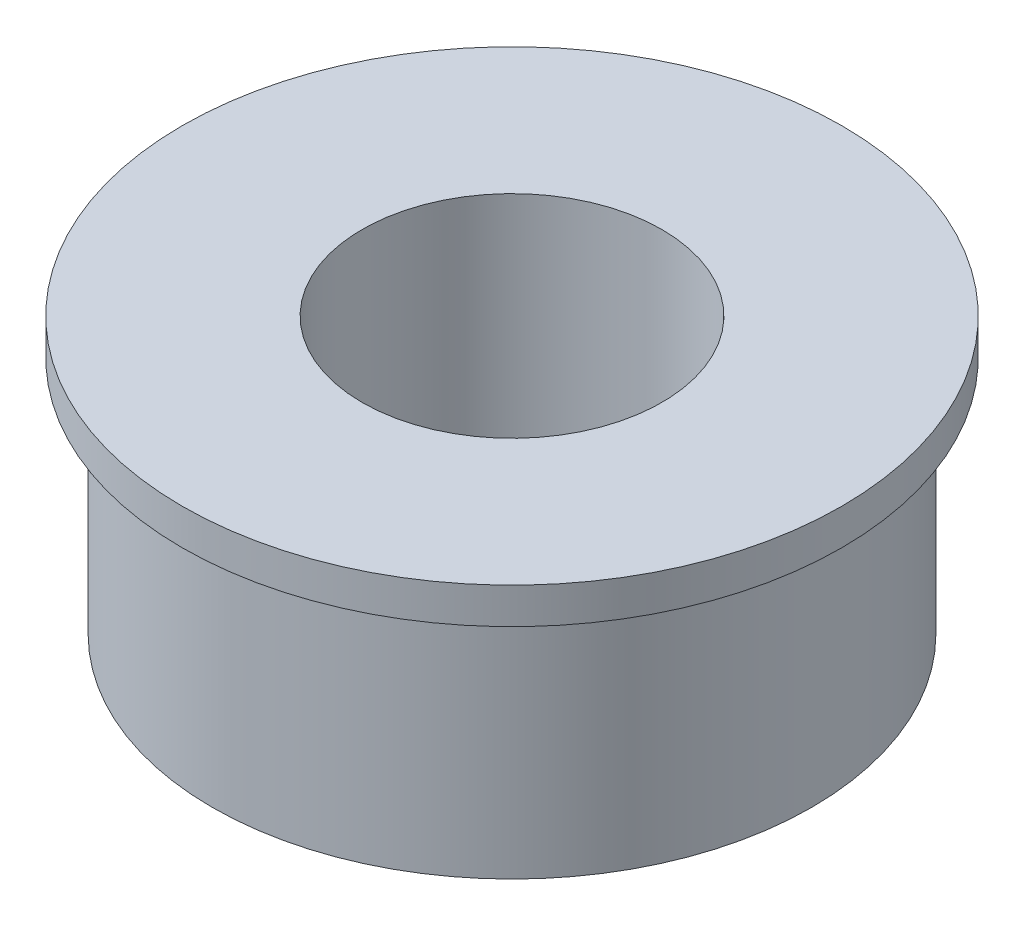
ISO-10303-21;
HEADER;
FILE_DESCRIPTION(('STEP AP214'),'2;1');
FILE_NAME('part.step','',(''),(''),'','','');
FILE_SCHEMA(('AUTOMOTIVE_DESIGN { 1 0 10303 214 1 1 1 1 }'));
ENDSEC;
DATA;
#1=APPLICATION_CONTEXT('core data for automotive mechanical design processes');
#2=APPLICATION_PROTOCOL_DEFINITION('international standard','automotive_design',2000,#1);
#3=PRODUCT_CONTEXT('',#1,'mechanical');
#4=PRODUCT('Part','Part','',(#3));
#5=PRODUCT_RELATED_PRODUCT_CATEGORY('part','',(#4));
#6=PRODUCT_DEFINITION_FORMATION('','',#4);
#7=PRODUCT_DEFINITION_CONTEXT('part definition',#1,'design');
#8=PRODUCT_DEFINITION('design','',#6,#7);
#9=PRODUCT_DEFINITION_SHAPE('','',#8);
#10=(LENGTH_UNIT() NAMED_UNIT(*) SI_UNIT(.MILLI.,.METRE.));
#11=(NAMED_UNIT(*) PLANE_ANGLE_UNIT() SI_UNIT($,.RADIAN.));
#12=(NAMED_UNIT(*) SI_UNIT($,.STERADIAN.) SOLID_ANGLE_UNIT());
#13=UNCERTAINTY_MEASURE_WITH_UNIT(LENGTH_MEASURE(1.E-05),#10,'distance_accuracy_value','');
#14=(GEOMETRIC_REPRESENTATION_CONTEXT(3) GLOBAL_UNCERTAINTY_ASSIGNED_CONTEXT((#13)) GLOBAL_UNIT_ASSIGNED_CONTEXT((#10,
#11,#12)) REPRESENTATION_CONTEXT('',''));
#15=CARTESIAN_POINT('',(0.,0.,0.));
#16=DIRECTION('',(0.,0.,1.));
#17=DIRECTION('',(1.,0.,0.));
#18=AXIS2_PLACEMENT_3D('',#15,#16,#17);
#19=CARTESIAN_POINT('',(0.,0.,0.));
#20=DIRECTION('',(0.,1.,0.));
#21=DIRECTION('',(0.,0.,1.));
#22=AXIS2_PLACEMENT_3D('',#19,#20,#21);
#23=PLANE('',#22);
#24=CARTESIAN_POINT('',(0.,0.,0.));
#25=DIRECTION('',(0.,1.,0.));
#26=DIRECTION('',(0.,0.,1.));
#27=AXIS2_PLACEMENT_3D('',#24,#25,#26);
#28=CIRCLE('',#27,5.);
#29=CARTESIAN_POINT('',(0.,0.,5.));
#30=VERTEX_POINT('',#29);
#31=EDGE_CURVE('E37',#30,#30,#28,.T.);
#32=ORIENTED_EDGE('',*,*,#31,.F.);
#33=EDGE_LOOP('',(#32));
#34=FACE_BOUND('',#33,.T.);
#35=CARTESIAN_POINT('',(0.,0.,0.));
#36=DIRECTION('',(0.,1.,0.));
#37=DIRECTION('',(0.,0.,1.));
#38=AXIS2_PLACEMENT_3D('',#35,#36,#37);
#39=CIRCLE('',#38,2.5);
#40=CARTESIAN_POINT('',(0.,0.,2.5));
#41=VERTEX_POINT('',#40);
#42=EDGE_CURVE('E44',#41,#41,#39,.T.);
#43=ORIENTED_EDGE('',*,*,#42,.T.);
#44=EDGE_LOOP('',(#43));
#45=FACE_BOUND('',#44,.T.);
#46=ADVANCED_FACE('F33',(#34,#45),#23,.F.);
#47=CARTESIAN_POINT('',(0.,4.,0.));
#48=DIRECTION('',(0.,-1.,0.));
#49=DIRECTION('',(0.,0.,-1.));
#50=AXIS2_PLACEMENT_3D('',#47,#48,#49);
#51=CYLINDRICAL_SURFACE('',#50,5.);
#52=CARTESIAN_POINT('',(0.,4.,0.));
#53=DIRECTION('',(0.,1.,0.));
#54=DIRECTION('',(0.,0.,1.));
#55=AXIS2_PLACEMENT_3D('',#52,#53,#54);
#56=CIRCLE('',#55,5.);
#57=CARTESIAN_POINT('',(0.,4.,5.));
#58=VERTEX_POINT('',#57);
#59=EDGE_CURVE('E10',#58,#58,#56,.T.);
#60=ORIENTED_EDGE('',*,*,#59,.F.);
#61=EDGE_LOOP('',(#60));
#62=FACE_BOUND('',#61,.T.);
#63=ORIENTED_EDGE('',*,*,#31,.T.);
#64=EDGE_LOOP('',(#63));
#65=FACE_BOUND('',#64,.T.);
#66=ADVANCED_FACE('F35',(#62,#65),#51,.T.);
#67=CARTESIAN_POINT('',(0.,4.,0.));
#68=DIRECTION('',(0.,-1.,0.));
#69=DIRECTION('',(0.,0.,-1.));
#70=AXIS2_PLACEMENT_3D('',#67,#68,#69);
#71=CYLINDRICAL_SURFACE('',#70,2.5);
#72=ORIENTED_EDGE('',*,*,#42,.F.);
#73=EDGE_LOOP('',(#72));
#74=FACE_BOUND('',#73,.T.);
#75=CARTESIAN_POINT('',(0.,4.6,0.));
#76=DIRECTION('',(0.,1.,0.));
#77=DIRECTION('',(0.,0.,1.));
#78=AXIS2_PLACEMENT_3D('',#75,#76,#77);
#79=CIRCLE('',#78,2.5);
#80=CARTESIAN_POINT('',(0.,4.6,2.5));
#81=VERTEX_POINT('',#80);
#82=EDGE_CURVE('E52',#81,#81,#79,.T.);
#83=ORIENTED_EDGE('',*,*,#82,.T.);
#84=EDGE_LOOP('',(#83));
#85=FACE_BOUND('',#84,.T.);
#86=ADVANCED_FACE('F58',(#74,#85),#71,.F.);
#87=CARTESIAN_POINT('',(0.,4.6,0.));
#88=DIRECTION('',(0.,1.,0.));
#89=DIRECTION('',(0.,0.,1.));
#90=AXIS2_PLACEMENT_3D('',#87,#88,#89);
#91=PLANE('',#90);
#92=CARTESIAN_POINT('',(0.,4.6,0.));
#93=DIRECTION('',(0.,1.,0.));
#94=DIRECTION('',(0.,0.,1.));
#95=AXIS2_PLACEMENT_3D('',#92,#93,#94);
#96=CIRCLE('',#95,5.5);
#97=CARTESIAN_POINT('',(0.,4.6,5.5));
#98=VERTEX_POINT('',#97);
#99=EDGE_CURVE('E48',#98,#98,#96,.T.);
#100=ORIENTED_EDGE('',*,*,#99,.T.);
#101=EDGE_LOOP('',(#100));
#102=FACE_BOUND('',#101,.T.);
#103=ORIENTED_EDGE('',*,*,#82,.F.);
#104=EDGE_LOOP('',(#103));
#105=FACE_BOUND('',#104,.T.);
#106=ADVANCED_FACE('F60',(#102,#105),#91,.T.);
#107=CARTESIAN_POINT('',(0.,4.,0.));
#108=DIRECTION('',(0.,1.,0.));
#109=DIRECTION('',(0.,0.,1.));
#110=AXIS2_PLACEMENT_3D('',#107,#108,#109);
#111=PLANE('',#110);
#112=ORIENTED_EDGE('',*,*,#59,.T.);
#113=EDGE_LOOP('',(#112));
#114=FACE_BOUND('',#113,.T.);
#115=CARTESIAN_POINT('',(0.,4.,0.));
#116=DIRECTION('',(0.,1.,0.));
#117=DIRECTION('',(0.,0.,1.));
#118=AXIS2_PLACEMENT_3D('',#115,#116,#117);
#119=CIRCLE('',#118,5.5);
#120=CARTESIAN_POINT('',(0.,4.,5.5));
#121=VERTEX_POINT('',#120);
#122=EDGE_CURVE('E49',#121,#121,#119,.T.);
#123=ORIENTED_EDGE('',*,*,#122,.F.);
#124=EDGE_LOOP('',(#123));
#125=FACE_BOUND('',#124,.T.);
#126=ADVANCED_FACE('F62',(#114,#125),#111,.F.);
#127=CARTESIAN_POINT('',(0.,4.6,0.));
#128=DIRECTION('',(0.,-1.,0.));
#129=DIRECTION('',(0.,0.,-1.));
#130=AXIS2_PLACEMENT_3D('',#127,#128,#129);
#131=CYLINDRICAL_SURFACE('',#130,5.5);
#132=ORIENTED_EDGE('',*,*,#99,.F.);
#133=EDGE_LOOP('',(#132));
#134=FACE_BOUND('',#133,.T.);
#135=ORIENTED_EDGE('',*,*,#122,.T.);
#136=EDGE_LOOP('',(#135));
#137=FACE_BOUND('',#136,.T.);
#138=ADVANCED_FACE('F69',(#134,#137),#131,.T.);
#139=CLOSED_SHELL('',(#46,#66,#86,#106,#126,#138));
#140=MANIFOLD_SOLID_BREP('B2',#139);
#141=ADVANCED_BREP_SHAPE_REPRESENTATION('',(#18,#140),#14);
#142=SHAPE_DEFINITION_REPRESENTATION(#9,#141);
ENDSEC;
END-ISO-10303-21;
